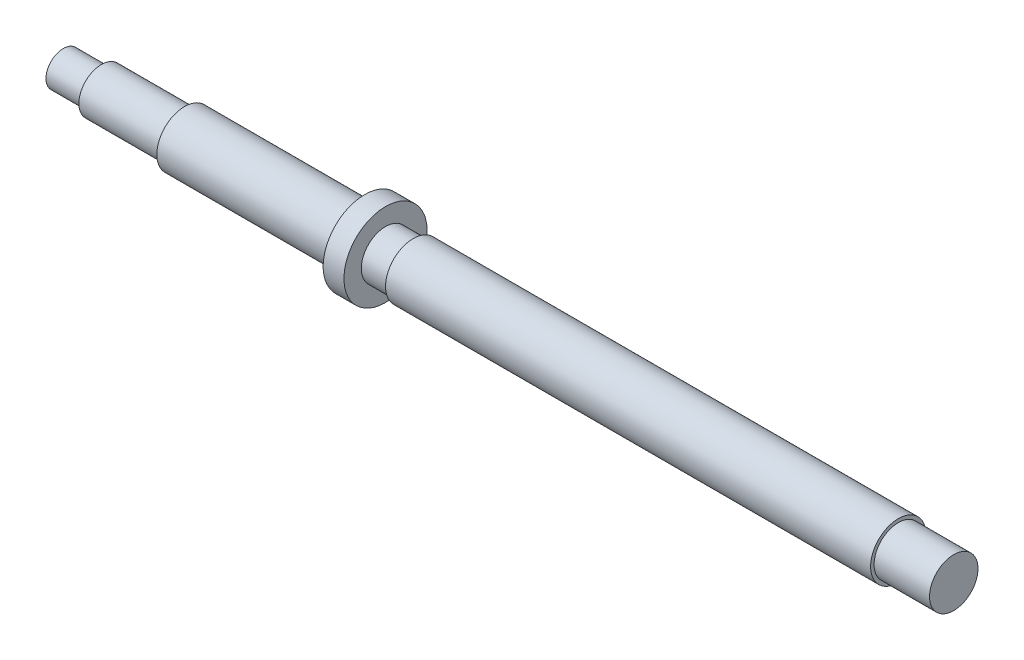
ISO-10303-21;
HEADER;
FILE_DESCRIPTION(('STEP AP214'),'2;1');
FILE_NAME('part.step','',(''),(''),'','','');
FILE_SCHEMA(('AUTOMOTIVE_DESIGN { 1 0 10303 214 1 1 1 1 }'));
ENDSEC;
DATA;
#1=APPLICATION_CONTEXT('core data for automotive mechanical design processes');
#2=APPLICATION_PROTOCOL_DEFINITION('international standard','automotive_design',2000,#1);
#3=PRODUCT_CONTEXT('',#1,'mechanical');
#4=PRODUCT('Part','Part','',(#3));
#5=PRODUCT_RELATED_PRODUCT_CATEGORY('part','',(#4));
#6=PRODUCT_DEFINITION_FORMATION('','',#4);
#7=PRODUCT_DEFINITION_CONTEXT('part definition',#1,'design');
#8=PRODUCT_DEFINITION('design','',#6,#7);
#9=PRODUCT_DEFINITION_SHAPE('','',#8);
#10=(LENGTH_UNIT() NAMED_UNIT(*) SI_UNIT(.MILLI.,.METRE.));
#11=(NAMED_UNIT(*) PLANE_ANGLE_UNIT() SI_UNIT($,.RADIAN.));
#12=(NAMED_UNIT(*) SI_UNIT($,.STERADIAN.) SOLID_ANGLE_UNIT());
#13=UNCERTAINTY_MEASURE_WITH_UNIT(LENGTH_MEASURE(1.E-05),#10,'distance_accuracy_value','');
#14=(GEOMETRIC_REPRESENTATION_CONTEXT(3) GLOBAL_UNCERTAINTY_ASSIGNED_CONTEXT((#13)) GLOBAL_UNIT_ASSIGNED_CONTEXT((#10,
#11,#12)) REPRESENTATION_CONTEXT('',''));
#15=CARTESIAN_POINT('',(0.,0.,0.));
#16=DIRECTION('',(0.,0.,1.));
#17=DIRECTION('',(1.,0.,0.));
#18=AXIS2_PLACEMENT_3D('',#15,#16,#17);
#19=CARTESIAN_POINT('',(-128.5,0.,0.));
#20=DIRECTION('',(-1.,0.,0.));
#21=DIRECTION('',(0.,0.,1.));
#22=AXIS2_PLACEMENT_3D('',#19,#20,#21);
#23=PLANE('',#22);
#24=CARTESIAN_POINT('',(-128.5,0.,0.));
#25=DIRECTION('',(1.,0.,0.));
#26=DIRECTION('',(0.,0.,-1.));
#27=AXIS2_PLACEMENT_3D('',#24,#25,#26);
#28=CIRCLE('',#27,5.00000000000005);
#29=CARTESIAN_POINT('',(-128.5,0.,-5.00000000000005));
#30=VERTEX_POINT('',#29);
#31=EDGE_CURVE('E10',#30,#30,#28,.T.);
#32=ORIENTED_EDGE('',*,*,#31,.F.);
#33=EDGE_LOOP('',(#32));
#34=FACE_BOUND('',#33,.T.);
#35=ADVANCED_FACE('F33',(#34),#23,.T.);
#36=CARTESIAN_POINT('',(128.5,0.,0.));
#37=DIRECTION('',(1.,0.,0.));
#38=DIRECTION('',(0.,0.,-1.));
#39=AXIS2_PLACEMENT_3D('',#36,#37,#38);
#40=CYLINDRICAL_SURFACE('',#39,5.00000000000005);
#41=ORIENTED_EDGE('',*,*,#31,.T.);
#42=EDGE_LOOP('',(#41));
#43=FACE_BOUND('',#42,.T.);
#44=CARTESIAN_POINT('',(-117.5,0.,0.));
#45=DIRECTION('',(1.,0.,0.));
#46=DIRECTION('',(0.,0.,-1.));
#47=AXIS2_PLACEMENT_3D('',#44,#45,#46);
#48=CIRCLE('',#47,5.00000000000004);
#49=CARTESIAN_POINT('',(-117.5,0.,-5.00000000000004));
#50=VERTEX_POINT('',#49);
#51=EDGE_CURVE('E39',#50,#50,#48,.T.);
#52=ORIENTED_EDGE('',*,*,#51,.F.);
#53=EDGE_LOOP('',(#52));
#54=FACE_BOUND('',#53,.T.);
#55=ADVANCED_FACE('F99',(#43,#54),#40,.T.);
#56=CARTESIAN_POINT('',(-117.5,5.00000000000001,0.));
#57=DIRECTION('',(-1.,0.,0.));
#58=DIRECTION('',(0.,0.,1.));
#59=AXIS2_PLACEMENT_3D('',#56,#57,#58);
#60=PLANE('',#59);
#61=ORIENTED_EDGE('',*,*,#51,.T.);
#62=EDGE_LOOP('',(#61));
#63=FACE_BOUND('',#62,.T.);
#64=CARTESIAN_POINT('',(-117.5,0.,0.));
#65=DIRECTION('',(1.,0.,0.));
#66=DIRECTION('',(0.,0.,-1.));
#67=AXIS2_PLACEMENT_3D('',#64,#65,#66);
#68=CIRCLE('',#67,6.50000000000005);
#69=CARTESIAN_POINT('',(-117.5,0.,-6.50000000000005));
#70=VERTEX_POINT('',#69);
#71=EDGE_CURVE('E43',#70,#70,#68,.T.);
#72=ORIENTED_EDGE('',*,*,#71,.F.);
#73=EDGE_LOOP('',(#72));
#74=FACE_BOUND('',#73,.T.);
#75=ADVANCED_FACE('F104',(#63,#74),#60,.T.);
#76=CARTESIAN_POINT('',(128.5,0.,0.));
#77=DIRECTION('',(1.,0.,0.));
#78=DIRECTION('',(0.,0.,-1.));
#79=AXIS2_PLACEMENT_3D('',#76,#77,#78);
#80=CYLINDRICAL_SURFACE('',#79,6.50000000000004);
#81=ORIENTED_EDGE('',*,*,#71,.T.);
#82=EDGE_LOOP('',(#81));
#83=FACE_BOUND('',#82,.T.);
#84=CARTESIAN_POINT('',(-93.5,0.,0.));
#85=DIRECTION('',(1.,0.,0.));
#86=DIRECTION('',(0.,0.,-1.));
#87=AXIS2_PLACEMENT_3D('',#84,#85,#86);
#88=CIRCLE('',#87,6.50000000000004);
#89=CARTESIAN_POINT('',(-93.5,0.,-6.50000000000004));
#90=VERTEX_POINT('',#89);
#91=EDGE_CURVE('E47',#90,#90,#88,.T.);
#92=ORIENTED_EDGE('',*,*,#91,.F.);
#93=EDGE_LOOP('',(#92));
#94=FACE_BOUND('',#93,.T.);
#95=ADVANCED_FACE('F108',(#83,#94),#80,.T.);
#96=CARTESIAN_POINT('',(-93.5,6.50000000000001,0.));
#97=DIRECTION('',(-1.,0.,0.));
#98=DIRECTION('',(0.,0.,1.));
#99=AXIS2_PLACEMENT_3D('',#96,#97,#98);
#100=PLANE('',#99);
#101=ORIENTED_EDGE('',*,*,#91,.T.);
#102=EDGE_LOOP('',(#101));
#103=FACE_BOUND('',#102,.T.);
#104=CARTESIAN_POINT('',(-93.5,0.,0.));
#105=DIRECTION('',(1.,0.,0.));
#106=DIRECTION('',(0.,0.,-1.));
#107=AXIS2_PLACEMENT_3D('',#104,#105,#106);
#108=CIRCLE('',#107,8.00000000000005);
#109=CARTESIAN_POINT('',(-93.5,0.,-8.00000000000005));
#110=VERTEX_POINT('',#109);
#111=EDGE_CURVE('E52',#110,#110,#108,.T.);
#112=ORIENTED_EDGE('',*,*,#111,.F.);
#113=EDGE_LOOP('',(#112));
#114=FACE_BOUND('',#113,.T.);
#115=ADVANCED_FACE('F114',(#103,#114),#100,.T.);
#116=CARTESIAN_POINT('',(128.5,0.,0.));
#117=DIRECTION('',(1.,0.,0.));
#118=DIRECTION('',(0.,0.,-1.));
#119=AXIS2_PLACEMENT_3D('',#116,#117,#118);
#120=CYLINDRICAL_SURFACE('',#119,8.00000000000004);
#121=ORIENTED_EDGE('',*,*,#111,.T.);
#122=EDGE_LOOP('',(#121));
#123=FACE_BOUND('',#122,.T.);
#124=CARTESIAN_POINT('',(-41.5,0.,0.));
#125=DIRECTION('',(1.,0.,0.));
#126=DIRECTION('',(0.,0.,-1.));
#127=AXIS2_PLACEMENT_3D('',#124,#125,#126);
#128=CIRCLE('',#127,8.00000000000003);
#129=CARTESIAN_POINT('',(-41.5,0.,-8.00000000000003));
#130=VERTEX_POINT('',#129);
#131=EDGE_CURVE('E55',#130,#130,#128,.T.);
#132=ORIENTED_EDGE('',*,*,#131,.F.);
#133=EDGE_LOOP('',(#132));
#134=FACE_BOUND('',#133,.T.);
#135=ADVANCED_FACE('F118',(#123,#134),#120,.T.);
#136=CARTESIAN_POINT('',(-41.5,8.,0.));
#137=DIRECTION('',(-1.,0.,0.));
#138=DIRECTION('',(0.,0.,1.));
#139=AXIS2_PLACEMENT_3D('',#136,#137,#138);
#140=PLANE('',#139);
#141=ORIENTED_EDGE('',*,*,#131,.T.);
#142=EDGE_LOOP('',(#141));
#143=FACE_BOUND('',#142,.T.);
#144=CARTESIAN_POINT('',(-41.5,0.,0.));
#145=DIRECTION('',(1.,0.,0.));
#146=DIRECTION('',(0.,0.,-1.));
#147=AXIS2_PLACEMENT_3D('',#144,#145,#146);
#148=CIRCLE('',#147,12.);
#149=CARTESIAN_POINT('',(-41.5,0.,-12.));
#150=VERTEX_POINT('',#149);
#151=EDGE_CURVE('E58',#150,#150,#148,.T.);
#152=ORIENTED_EDGE('',*,*,#151,.F.);
#153=EDGE_LOOP('',(#152));
#154=FACE_BOUND('',#153,.T.);
#155=ADVANCED_FACE('F122',(#143,#154),#140,.T.);
#156=CARTESIAN_POINT('',(128.5,0.,0.));
#157=DIRECTION('',(1.,0.,0.));
#158=DIRECTION('',(0.,0.,-1.));
#159=AXIS2_PLACEMENT_3D('',#156,#157,#158);
#160=CYLINDRICAL_SURFACE('',#159,12.);
#161=ORIENTED_EDGE('',*,*,#151,.T.);
#162=EDGE_LOOP('',(#161));
#163=FACE_BOUND('',#162,.T.);
#164=CARTESIAN_POINT('',(-35.5,0.,0.));
#165=DIRECTION('',(1.,0.,0.));
#166=DIRECTION('',(0.,0.,-1.));
#167=AXIS2_PLACEMENT_3D('',#164,#165,#166);
#168=CIRCLE('',#167,12.);
#169=CARTESIAN_POINT('',(-35.5,0.,-12.));
#170=VERTEX_POINT('',#169);
#171=EDGE_CURVE('E61',#170,#170,#168,.T.);
#172=ORIENTED_EDGE('',*,*,#171,.F.);
#173=EDGE_LOOP('',(#172));
#174=FACE_BOUND('',#173,.T.);
#175=ADVANCED_FACE('F126',(#163,#174),#160,.T.);
#176=CARTESIAN_POINT('',(-35.5,12.,0.));
#177=DIRECTION('',(1.,0.,0.));
#178=DIRECTION('',(0.,0.,-1.));
#179=AXIS2_PLACEMENT_3D('',#176,#177,#178);
#180=PLANE('',#179);
#181=ORIENTED_EDGE('',*,*,#171,.T.);
#182=EDGE_LOOP('',(#181));
#183=FACE_BOUND('',#182,.T.);
#184=CARTESIAN_POINT('',(-35.5,0.,0.));
#185=DIRECTION('',(1.,0.,0.));
#186=DIRECTION('',(0.,0.,-1.));
#187=AXIS2_PLACEMENT_3D('',#184,#185,#186);
#188=CIRCLE('',#187,7.);
#189=CARTESIAN_POINT('',(-35.5,0.,-7.));
#190=VERTEX_POINT('',#189);
#191=EDGE_CURVE('E64',#190,#190,#188,.T.);
#192=ORIENTED_EDGE('',*,*,#191,.F.);
#193=EDGE_LOOP('',(#192));
#194=FACE_BOUND('',#193,.T.);
#195=ADVANCED_FACE('F130',(#183,#194),#180,.T.);
#196=CARTESIAN_POINT('',(128.5,0.,0.));
#197=DIRECTION('',(1.,0.,0.));
#198=DIRECTION('',(0.,0.,-1.));
#199=AXIS2_PLACEMENT_3D('',#196,#197,#198);
#200=CYLINDRICAL_SURFACE('',#199,7.);
#201=ORIENTED_EDGE('',*,*,#191,.T.);
#202=EDGE_LOOP('',(#201));
#203=FACE_BOUND('',#202,.T.);
#204=CARTESIAN_POINT('',(-27.5,0.,0.));
#205=DIRECTION('',(1.,0.,0.));
#206=DIRECTION('',(0.,0.,-1.));
#207=AXIS2_PLACEMENT_3D('',#204,#205,#206);
#208=CIRCLE('',#207,7.);
#209=CARTESIAN_POINT('',(-27.5,0.,-7.));
#210=VERTEX_POINT('',#209);
#211=EDGE_CURVE('E67',#210,#210,#208,.T.);
#212=ORIENTED_EDGE('',*,*,#211,.F.);
#213=EDGE_LOOP('',(#212));
#214=FACE_BOUND('',#213,.T.);
#215=ADVANCED_FACE('F134',(#203,#214),#200,.T.);
#216=CARTESIAN_POINT('',(-27.5,6.99999999999997,0.));
#217=DIRECTION('',(-1.,0.,0.));
#218=DIRECTION('',(0.,0.,1.));
#219=AXIS2_PLACEMENT_3D('',#216,#217,#218);
#220=PLANE('',#219);
#221=ORIENTED_EDGE('',*,*,#211,.T.);
#222=EDGE_LOOP('',(#221));
#223=FACE_BOUND('',#222,.T.);
#224=CARTESIAN_POINT('',(-27.5,0.,0.));
#225=DIRECTION('',(1.,0.,0.));
#226=DIRECTION('',(0.,0.,-1.));
#227=AXIS2_PLACEMENT_3D('',#224,#225,#226);
#228=CIRCLE('',#227,8.00000000000002);
#229=CARTESIAN_POINT('',(-27.5,0.,-8.00000000000002));
#230=VERTEX_POINT('',#229);
#231=EDGE_CURVE('E70',#230,#230,#228,.T.);
#232=ORIENTED_EDGE('',*,*,#231,.F.);
#233=EDGE_LOOP('',(#232));
#234=FACE_BOUND('',#233,.T.);
#235=ADVANCED_FACE('F138',(#223,#234),#220,.T.);
#236=CARTESIAN_POINT('',(128.5,0.,0.));
#237=DIRECTION('',(1.,0.,0.));
#238=DIRECTION('',(0.,0.,-1.));
#239=AXIS2_PLACEMENT_3D('',#236,#237,#238);
#240=CYLINDRICAL_SURFACE('',#239,8.00000000000002);
#241=ORIENTED_EDGE('',*,*,#231,.T.);
#242=EDGE_LOOP('',(#241));
#243=FACE_BOUND('',#242,.T.);
#244=CARTESIAN_POINT('',(112.5,0.,0.));
#245=DIRECTION('',(1.,0.,0.));
#246=DIRECTION('',(0.,0.,-1.));
#247=AXIS2_PLACEMENT_3D('',#244,#245,#246);
#248=CIRCLE('',#247,8.00000000000002);
#249=CARTESIAN_POINT('',(112.5,0.,-8.00000000000002));
#250=VERTEX_POINT('',#249);
#251=EDGE_CURVE('E73',#250,#250,#248,.T.);
#252=ORIENTED_EDGE('',*,*,#251,.F.);
#253=EDGE_LOOP('',(#252));
#254=FACE_BOUND('',#253,.T.);
#255=ADVANCED_FACE('F95',(#243,#254),#240,.T.);
#256=CARTESIAN_POINT('',(112.5,7.99999999999998,0.));
#257=DIRECTION('',(1.,0.,0.));
#258=DIRECTION('',(0.,0.,-1.));
#259=AXIS2_PLACEMENT_3D('',#256,#257,#258);
#260=PLANE('',#259);
#261=ORIENTED_EDGE('',*,*,#251,.T.);
#262=EDGE_LOOP('',(#261));
#263=FACE_BOUND('',#262,.T.);
#264=CARTESIAN_POINT('',(112.5,0.,0.));
#265=DIRECTION('',(1.,0.,0.));
#266=DIRECTION('',(0.,0.,-1.));
#267=AXIS2_PLACEMENT_3D('',#264,#265,#266);
#268=CIRCLE('',#267,7.);
#269=CARTESIAN_POINT('',(112.5,0.,-7.));
#270=VERTEX_POINT('',#269);
#271=EDGE_CURVE('E76',#270,#270,#268,.T.);
#272=ORIENTED_EDGE('',*,*,#271,.F.);
#273=EDGE_LOOP('',(#272));
#274=FACE_BOUND('',#273,.T.);
#275=ADVANCED_FACE('F87',(#263,#274),#260,.T.);
#276=CARTESIAN_POINT('',(128.5,0.,0.));
#277=DIRECTION('',(1.,0.,0.));
#278=DIRECTION('',(0.,0.,-1.));
#279=AXIS2_PLACEMENT_3D('',#276,#277,#278);
#280=CYLINDRICAL_SURFACE('',#279,7.);
#281=ORIENTED_EDGE('',*,*,#271,.T.);
#282=EDGE_LOOP('',(#281));
#283=FACE_BOUND('',#282,.T.);
#284=CARTESIAN_POINT('',(128.5,0.,0.));
#285=DIRECTION('',(1.,0.,0.));
#286=DIRECTION('',(0.,0.,-1.));
#287=AXIS2_PLACEMENT_3D('',#284,#285,#286);
#288=CIRCLE('',#287,7.);
#289=CARTESIAN_POINT('',(128.5,0.,-7.));
#290=VERTEX_POINT('',#289);
#291=EDGE_CURVE('E79',#290,#290,#288,.T.);
#292=ORIENTED_EDGE('',*,*,#291,.F.);
#293=EDGE_LOOP('',(#292));
#294=FACE_BOUND('',#293,.T.);
#295=ADVANCED_FACE('F85',(#283,#294),#280,.T.);
#296=CARTESIAN_POINT('',(128.5,6.99999999999997,0.));
#297=DIRECTION('',(1.,0.,0.));
#298=DIRECTION('',(0.,0.,-1.));
#299=AXIS2_PLACEMENT_3D('',#296,#297,#298);
#300=PLANE('',#299);
#301=ORIENTED_EDGE('',*,*,#291,.T.);
#302=EDGE_LOOP('',(#301));
#303=FACE_BOUND('',#302,.T.);
#304=ADVANCED_FACE('F83',(#303),#300,.T.);
#305=CLOSED_SHELL('',(#35,#55,#75,#95,#115,#135,#155,#175,#195,#215,#235,#255,#275,#295,#304));
#306=MANIFOLD_SOLID_BREP('B2',#305);
#307=ADVANCED_BREP_SHAPE_REPRESENTATION('',(#18,#306),#14);
#308=SHAPE_DEFINITION_REPRESENTATION(#9,#307);
ENDSEC;
END-ISO-10303-21;
